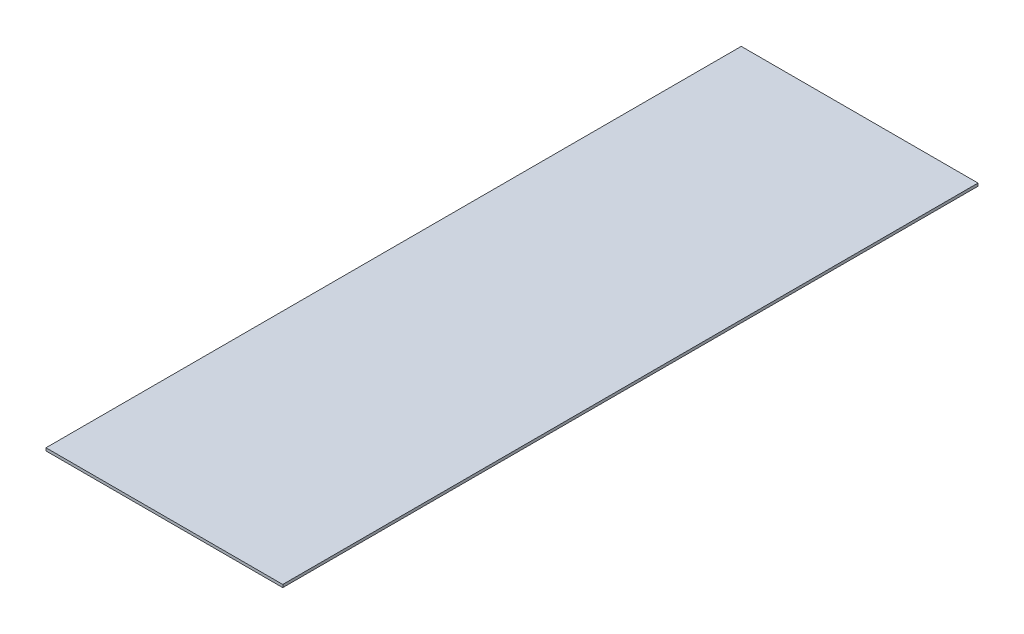
ISO-10303-21;
HEADER;
FILE_DESCRIPTION(('STEP AP214'),'2;1');
FILE_NAME('part.step','',(''),(''),'','','');
FILE_SCHEMA(('AUTOMOTIVE_DESIGN { 1 0 10303 214 1 1 1 1 }'));
ENDSEC;
DATA;
#1=APPLICATION_CONTEXT('core data for automotive mechanical design processes');
#2=APPLICATION_PROTOCOL_DEFINITION('international standard','automotive_design',2000,#1);
#3=PRODUCT_CONTEXT('',#1,'mechanical');
#4=PRODUCT('Part','Part','',(#3));
#5=PRODUCT_RELATED_PRODUCT_CATEGORY('part','',(#4));
#6=PRODUCT_DEFINITION_FORMATION('','',#4);
#7=PRODUCT_DEFINITION_CONTEXT('part definition',#1,'design');
#8=PRODUCT_DEFINITION('design','',#6,#7);
#9=PRODUCT_DEFINITION_SHAPE('','',#8);
#10=(LENGTH_UNIT() NAMED_UNIT(*) SI_UNIT(.MILLI.,.METRE.));
#11=(NAMED_UNIT(*) PLANE_ANGLE_UNIT() SI_UNIT($,.RADIAN.));
#12=(NAMED_UNIT(*) SI_UNIT($,.STERADIAN.) SOLID_ANGLE_UNIT());
#13=UNCERTAINTY_MEASURE_WITH_UNIT(LENGTH_MEASURE(1.E-05),#10,'distance_accuracy_value','');
#14=(GEOMETRIC_REPRESENTATION_CONTEXT(3) GLOBAL_UNCERTAINTY_ASSIGNED_CONTEXT((#13)) GLOBAL_UNIT_ASSIGNED_CONTEXT((#10,
#11,#12)) REPRESENTATION_CONTEXT('',''));
#15=CARTESIAN_POINT('',(0.,0.,0.));
#16=DIRECTION('',(0.,0.,1.));
#17=DIRECTION('',(1.,0.,0.));
#18=AXIS2_PLACEMENT_3D('',#15,#16,#17);
#19=CARTESIAN_POINT('',(0.,2.,0.));
#20=DIRECTION('',(0.,0.,1.));
#21=DIRECTION('',(1.,0.,0.));
#22=AXIS2_PLACEMENT_3D('',#19,#20,#21);
#23=PLANE('',#22);
#24=DIRECTION('',(-1.,0.,0.));
#25=VECTOR('',#24,1.);
#26=CARTESIAN_POINT('',(0.,0.,0.));
#27=LINE('',#26,#25);
#28=CARTESIAN_POINT('',(0.,0.,0.));
#29=VERTEX_POINT('',#28);
#30=CARTESIAN_POINT('',(-170.27,0.,0.));
#31=VERTEX_POINT('',#30);
#32=EDGE_CURVE('E103',#29,#31,#27,.T.);
#33=ORIENTED_EDGE('',*,*,#32,.T.);
#34=DIRECTION('',(0.,-1.,0.));
#35=VECTOR('',#34,1.);
#36=CARTESIAN_POINT('',(-170.27,2.,0.));
#37=LINE('',#36,#35);
#38=CARTESIAN_POINT('',(-170.27,2.,0.));
#39=VERTEX_POINT('',#38);
#40=EDGE_CURVE('E11',#39,#31,#37,.T.);
#41=ORIENTED_EDGE('',*,*,#40,.F.);
#42=DIRECTION('',(-1.,0.,0.));
#43=VECTOR('',#42,1.);
#44=CARTESIAN_POINT('',(0.,2.,0.));
#45=LINE('',#44,#43);
#46=CARTESIAN_POINT('',(0.,2.,0.));
#47=VERTEX_POINT('',#46);
#48=EDGE_CURVE('E91',#47,#39,#45,.T.);
#49=ORIENTED_EDGE('',*,*,#48,.F.);
#50=DIRECTION('',(0.,-1.,0.));
#51=VECTOR('',#50,1.);
#52=CARTESIAN_POINT('',(0.,2.,0.));
#53=LINE('',#52,#51);
#54=EDGE_CURVE('E99',#47,#29,#53,.T.);
#55=ORIENTED_EDGE('',*,*,#54,.T.);
#56=EDGE_LOOP('',(#33,#41,#49,#55));
#57=FACE_BOUND('',#56,.T.);
#58=ADVANCED_FACE('F40',(#57),#23,.F.);
#59=CARTESIAN_POINT('',(-170.27,2.,0.));
#60=DIRECTION('',(1.,0.,0.));
#61=DIRECTION('',(0.,0.,-1.));
#62=AXIS2_PLACEMENT_3D('',#59,#60,#61);
#63=PLANE('',#62);
#64=DIRECTION('',(0.,0.,1.));
#65=VECTOR('',#64,1.);
#66=CARTESIAN_POINT('',(-170.27,0.,0.));
#67=LINE('',#66,#65);
#68=CARTESIAN_POINT('',(-170.27,0.,500.));
#69=VERTEX_POINT('',#68);
#70=EDGE_CURVE('E95',#31,#69,#67,.T.);
#71=ORIENTED_EDGE('',*,*,#70,.T.);
#72=DIRECTION('',(0.,-1.,0.));
#73=VECTOR('',#72,1.);
#74=CARTESIAN_POINT('',(-170.27,2.,500.));
#75=LINE('',#74,#73);
#76=CARTESIAN_POINT('',(-170.27,2.,500.));
#77=VERTEX_POINT('',#76);
#78=EDGE_CURVE('E48',#77,#69,#75,.T.);
#79=ORIENTED_EDGE('',*,*,#78,.F.);
#80=DIRECTION('',(0.,0.,1.));
#81=VECTOR('',#80,1.);
#82=CARTESIAN_POINT('',(-170.27,2.,0.));
#83=LINE('',#82,#81);
#84=EDGE_CURVE('E86',#39,#77,#83,.T.);
#85=ORIENTED_EDGE('',*,*,#84,.F.);
#86=ORIENTED_EDGE('',*,*,#40,.T.);
#87=EDGE_LOOP('',(#71,#79,#85,#86));
#88=FACE_BOUND('',#87,.T.);
#89=ADVANCED_FACE('F94',(#88),#63,.F.);
#90=CARTESIAN_POINT('',(-170.27,2.,500.));
#91=DIRECTION('',(0.,0.,-1.));
#92=DIRECTION('',(-1.,0.,0.));
#93=AXIS2_PLACEMENT_3D('',#90,#91,#92);
#94=PLANE('',#93);
#95=DIRECTION('',(1.,0.,0.));
#96=VECTOR('',#95,1.);
#97=CARTESIAN_POINT('',(-170.27,0.,500.));
#98=LINE('',#97,#96);
#99=CARTESIAN_POINT('',(0.,0.,500.));
#100=VERTEX_POINT('',#99);
#101=EDGE_CURVE('E73',#69,#100,#98,.T.);
#102=ORIENTED_EDGE('',*,*,#101,.T.);
#103=DIRECTION('',(0.,-1.,0.));
#104=VECTOR('',#103,1.);
#105=CARTESIAN_POINT('',(0.,2.,500.));
#106=LINE('',#105,#104);
#107=CARTESIAN_POINT('',(0.,2.,500.));
#108=VERTEX_POINT('',#107);
#109=EDGE_CURVE('E96',#108,#100,#106,.T.);
#110=ORIENTED_EDGE('',*,*,#109,.F.);
#111=DIRECTION('',(1.,0.,0.));
#112=VECTOR('',#111,1.);
#113=CARTESIAN_POINT('',(-170.27,2.,500.));
#114=LINE('',#113,#112);
#115=EDGE_CURVE('E89',#77,#108,#114,.T.);
#116=ORIENTED_EDGE('',*,*,#115,.F.);
#117=ORIENTED_EDGE('',*,*,#78,.T.);
#118=EDGE_LOOP('',(#102,#110,#116,#117));
#119=FACE_BOUND('',#118,.T.);
#120=ADVANCED_FACE('F97',(#119),#94,.F.);
#121=CARTESIAN_POINT('',(0.,2.,500.));
#122=DIRECTION('',(-1.,0.,0.));
#123=DIRECTION('',(0.,0.,1.));
#124=AXIS2_PLACEMENT_3D('',#121,#122,#123);
#125=PLANE('',#124);
#126=DIRECTION('',(0.,0.,-1.));
#127=VECTOR('',#126,1.);
#128=CARTESIAN_POINT('',(0.,0.,500.));
#129=LINE('',#128,#127);
#130=EDGE_CURVE('E79',#100,#29,#129,.T.);
#131=ORIENTED_EDGE('',*,*,#130,.T.);
#132=ORIENTED_EDGE('',*,*,#54,.F.);
#133=DIRECTION('',(0.,0.,-1.));
#134=VECTOR('',#133,1.);
#135=CARTESIAN_POINT('',(0.,2.,500.));
#136=LINE('',#135,#134);
#137=EDGE_CURVE('E56',#108,#47,#136,.T.);
#138=ORIENTED_EDGE('',*,*,#137,.F.);
#139=ORIENTED_EDGE('',*,*,#109,.T.);
#140=EDGE_LOOP('',(#131,#132,#138,#139));
#141=FACE_BOUND('',#140,.T.);
#142=ADVANCED_FACE('F110',(#141),#125,.F.);
#143=CARTESIAN_POINT('',(0.,2.,0.));
#144=DIRECTION('',(0.,1.,0.));
#145=DIRECTION('',(0.,0.,1.));
#146=AXIS2_PLACEMENT_3D('',#143,#144,#145);
#147=PLANE('',#146);
#148=ORIENTED_EDGE('',*,*,#48,.T.);
#149=ORIENTED_EDGE('',*,*,#84,.T.);
#150=ORIENTED_EDGE('',*,*,#115,.T.);
#151=ORIENTED_EDGE('',*,*,#137,.T.);
#152=EDGE_LOOP('',(#148,#149,#150,#151));
#153=FACE_BOUND('',#152,.T.);
#154=ADVANCED_FACE('F87',(#153),#147,.T.);
#155=CARTESIAN_POINT('',(0.,0.,0.));
#156=DIRECTION('',(0.,1.,0.));
#157=DIRECTION('',(0.,0.,1.));
#158=AXIS2_PLACEMENT_3D('',#155,#156,#157);
#159=PLANE('',#158);
#160=ORIENTED_EDGE('',*,*,#32,.F.);
#161=ORIENTED_EDGE('',*,*,#130,.F.);
#162=ORIENTED_EDGE('',*,*,#101,.F.);
#163=ORIENTED_EDGE('',*,*,#70,.F.);
#164=EDGE_LOOP('',(#160,#161,#162,#163));
#165=FACE_BOUND('',#164,.T.);
#166=ADVANCED_FACE('F113',(#165),#159,.F.);
#167=CLOSED_SHELL('',(#58,#89,#120,#142,#154,#166));
#168=MANIFOLD_SOLID_BREP('B2',#167);
#169=ADVANCED_BREP_SHAPE_REPRESENTATION('',(#18,#168),#14);
#170=SHAPE_DEFINITION_REPRESENTATION(#9,#169);
ENDSEC;
END-ISO-10303-21;
